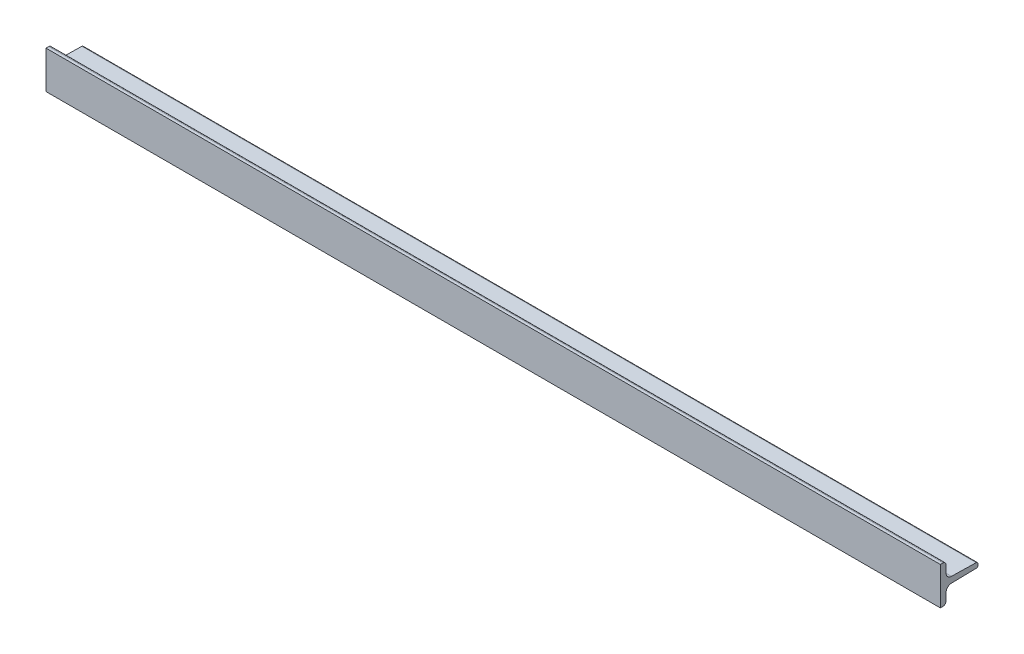
ISO-10303-21;
HEADER;
FILE_DESCRIPTION(('STEP AP214'),'2;1');
FILE_NAME('part.step','',(''),(''),'','','');
FILE_SCHEMA(('AUTOMOTIVE_DESIGN { 1 0 10303 214 1 1 1 1 }'));
ENDSEC;
DATA;
#1=APPLICATION_CONTEXT('core data for automotive mechanical design processes');
#2=APPLICATION_PROTOCOL_DEFINITION('international standard','automotive_design',2000,#1);
#3=PRODUCT_CONTEXT('',#1,'mechanical');
#4=PRODUCT('Part','Part','',(#3));
#5=PRODUCT_RELATED_PRODUCT_CATEGORY('part','',(#4));
#6=PRODUCT_DEFINITION_FORMATION('','',#4);
#7=PRODUCT_DEFINITION_CONTEXT('part definition',#1,'design');
#8=PRODUCT_DEFINITION('design','',#6,#7);
#9=PRODUCT_DEFINITION_SHAPE('','',#8);
#10=(LENGTH_UNIT() NAMED_UNIT(*) SI_UNIT(.MILLI.,.METRE.));
#11=(NAMED_UNIT(*) PLANE_ANGLE_UNIT() SI_UNIT($,.RADIAN.));
#12=(NAMED_UNIT(*) SI_UNIT($,.STERADIAN.) SOLID_ANGLE_UNIT());
#13=UNCERTAINTY_MEASURE_WITH_UNIT(LENGTH_MEASURE(1.E-05),#10,'distance_accuracy_value','');
#14=(GEOMETRIC_REPRESENTATION_CONTEXT(3) GLOBAL_UNCERTAINTY_ASSIGNED_CONTEXT((#13)) GLOBAL_UNIT_ASSIGNED_CONTEXT((#10,
#11,#12)) REPRESENTATION_CONTEXT('',''));
#15=CARTESIAN_POINT('',(0.,0.,0.));
#16=DIRECTION('',(0.,0.,1.));
#17=DIRECTION('',(1.,0.,0.));
#18=AXIS2_PLACEMENT_3D('',#15,#16,#17);
#19=CARTESIAN_POINT('',(475.,-9.99999999999999,20.));
#20=DIRECTION('',(0.,1.,0.));
#21=DIRECTION('',(0.,0.,1.));
#22=AXIS2_PLACEMENT_3D('',#19,#20,#21);
#23=PLANE('',#22);
#24=DIRECTION('',(0.,0.,-1.));
#25=VECTOR('',#24,1.);
#26=CARTESIAN_POINT('',(0.,-9.99999999999999,20.));
#27=LINE('',#26,#25);
#28=CARTESIAN_POINT('',(0.,-9.99999999999999,20.));
#29=VERTEX_POINT('',#28);
#30=CARTESIAN_POINT('',(0.,-9.99999999999999,18.570314587422));
#31=VERTEX_POINT('',#30);
#32=EDGE_CURVE('E211',#29,#31,#27,.T.);
#33=ORIENTED_EDGE('',*,*,#32,.T.);
#34=DIRECTION('',(-1.,0.,0.));
#35=VECTOR('',#34,1.);
#36=CARTESIAN_POINT('',(475.,-9.99999999999999,18.570314587422));
#37=LINE('',#36,#35);
#38=CARTESIAN_POINT('',(475.,-9.99999999999999,18.570314587422));
#39=VERTEX_POINT('',#38);
#40=EDGE_CURVE('E13',#39,#31,#37,.T.);
#41=ORIENTED_EDGE('',*,*,#40,.F.);
#42=DIRECTION('',(0.,0.,-1.));
#43=VECTOR('',#42,1.);
#44=CARTESIAN_POINT('',(475.,-9.99999999999999,20.));
#45=LINE('',#44,#43);
#46=CARTESIAN_POINT('',(475.,-9.99999999999999,20.));
#47=VERTEX_POINT('',#46);
#48=EDGE_CURVE('E237',#47,#39,#45,.T.);
#49=ORIENTED_EDGE('',*,*,#48,.F.);
#50=DIRECTION('',(-1.,0.,0.));
#51=VECTOR('',#50,1.);
#52=CARTESIAN_POINT('',(475.,-9.99999999999999,20.));
#53=LINE('',#52,#51);
#54=EDGE_CURVE('E207',#47,#29,#53,.T.);
#55=ORIENTED_EDGE('',*,*,#54,.T.);
#56=EDGE_LOOP('',(#33,#41,#49,#55));
#57=FACE_BOUND('',#56,.T.);
#58=ADVANCED_FACE('F79',(#57),#23,.F.);
#59=CARTESIAN_POINT('',(475.,-8.49999999999999,18.570314587422));
#60=DIRECTION('',(-1.,0.,0.));
#61=DIRECTION('',(0.,0.,1.));
#62=AXIS2_PLACEMENT_3D('',#59,#60,#61);
#63=CYLINDRICAL_SURFACE('',#62,1.5);
#64=CARTESIAN_POINT('',(0.,-8.49999999999999,18.570314587422));
#65=DIRECTION('',(1.,0.,0.));
#66=DIRECTION('',(0.,0.,1.));
#67=AXIS2_PLACEMENT_3D('',#64,#65,#66);
#68=CIRCLE('',#67,1.5);
#69=CARTESIAN_POINT('',(0.,-8.53000020943977,17.0706146216177));
#70=VERTEX_POINT('',#69);
#71=EDGE_CURVE('E214',#31,#70,#68,.T.);
#72=ORIENTED_EDGE('',*,*,#71,.T.);
#73=DIRECTION('',(-1.,0.,0.));
#74=VECTOR('',#73,1.);
#75=CARTESIAN_POINT('',(475.,-8.53000020943977,17.0706146216177));
#76=LINE('',#75,#74);
#77=CARTESIAN_POINT('',(475.,-8.53000020943977,17.0706146216177));
#78=VERTEX_POINT('',#77);
#79=EDGE_CURVE('E87',#78,#70,#76,.T.);
#80=ORIENTED_EDGE('',*,*,#79,.F.);
#81=CARTESIAN_POINT('',(475.,-8.49999999999999,18.570314587422));
#82=DIRECTION('',(1.,0.,0.));
#83=DIRECTION('',(0.,0.,1.));
#84=AXIS2_PLACEMENT_3D('',#81,#82,#83);
#85=CIRCLE('',#84,1.5);
#86=EDGE_CURVE('E156',#39,#78,#85,.T.);
#87=ORIENTED_EDGE('',*,*,#86,.F.);
#88=ORIENTED_EDGE('',*,*,#40,.T.);
#89=EDGE_LOOP('',(#72,#80,#87,#88));
#90=FACE_BOUND('',#89,.T.);
#91=ADVANCED_FACE('F325',(#90),#63,.T.);
#92=CARTESIAN_POINT('',(475.,-4.52043643216432,16.9904067428265));
#93=DIRECTION('',(0.,0.020000139626522,0.9997999772029));
#94=DIRECTION('',(0.,-0.9997999772029,0.020000139626522));
#95=AXIS2_PLACEMENT_3D('',#92,#93,#94);
#96=PLANE('',#95);
#97=DIRECTION('',(0.,0.9997999772029,-0.020000139626522));
#98=VECTOR('',#97,1.);
#99=CARTESIAN_POINT('',(0.,-4.52043643216432,16.9904067428265));
#100=LINE('',#99,#98);
#101=CARTESIAN_POINT('',(0.,-4.52043643216432,16.9904067428265));
#102=VERTEX_POINT('',#101);
#103=EDGE_CURVE('E216',#70,#102,#100,.T.);
#104=ORIENTED_EDGE('',*,*,#103,.T.);
#105=DIRECTION('',(-1.,0.,0.));
#106=VECTOR('',#105,1.);
#107=CARTESIAN_POINT('',(475.,-4.52043643216432,16.9904067428265));
#108=LINE('',#107,#106);
#109=CARTESIAN_POINT('',(475.,-4.52043643216432,16.9904067428265));
#110=VERTEX_POINT('',#109);
#111=EDGE_CURVE('E262',#110,#102,#108,.T.);
#112=ORIENTED_EDGE('',*,*,#111,.F.);
#113=DIRECTION('',(0.,0.9997999772029,-0.020000139626522));
#114=VECTOR('',#113,1.);
#115=CARTESIAN_POINT('',(475.,-4.52043643216432,16.9904067428265));
#116=LINE('',#115,#114);
#117=EDGE_CURVE('E270',#78,#110,#116,.T.);
#118=ORIENTED_EDGE('',*,*,#117,.F.);
#119=ORIENTED_EDGE('',*,*,#79,.T.);
#120=EDGE_LOOP('',(#104,#112,#118,#119));
#121=FACE_BOUND('',#120,.T.);
#122=ADVANCED_FACE('F268',(#121),#96,.F.);
#123=CARTESIAN_POINT('',(475.,-4.58043685104389,13.9910068112178));
#124=DIRECTION('',(-1.,0.,0.));
#125=DIRECTION('',(0.,0.,1.));
#126=AXIS2_PLACEMENT_3D('',#123,#124,#125);
#127=CYLINDRICAL_SURFACE('',#126,3.);
#128=CARTESIAN_POINT('',(0.,-4.58043685104389,13.9910068112178));
#129=DIRECTION('',(-1.,0.,0.));
#130=DIRECTION('',(0.,0.,-1.));
#131=AXIS2_PLACEMENT_3D('',#128,#129,#130);
#132=CIRCLE('',#131,3.);
#133=CARTESIAN_POINT('',(0.,-1.58103691943519,14.0510072300973));
#134=VERTEX_POINT('',#133);
#135=EDGE_CURVE('E218',#102,#134,#132,.T.);
#136=ORIENTED_EDGE('',*,*,#135,.T.);
#137=DIRECTION('',(-1.,0.,0.));
#138=VECTOR('',#137,1.);
#139=CARTESIAN_POINT('',(475.,-1.58103691943519,14.0510072300973));
#140=LINE('',#139,#138);
#141=CARTESIAN_POINT('',(475.,-1.58103691943519,14.0510072300973));
#142=VERTEX_POINT('',#141);
#143=EDGE_CURVE('E259',#142,#134,#140,.T.);
#144=ORIENTED_EDGE('',*,*,#143,.F.);
#145=CARTESIAN_POINT('',(475.,-4.58043685104389,13.9910068112178));
#146=DIRECTION('',(-1.,0.,0.));
#147=DIRECTION('',(0.,0.,-1.));
#148=AXIS2_PLACEMENT_3D('',#145,#146,#147);
#149=CIRCLE('',#148,3.);
#150=EDGE_CURVE('E288',#110,#142,#149,.T.);
#151=ORIENTED_EDGE('',*,*,#150,.F.);
#152=ORIENTED_EDGE('',*,*,#111,.T.);
#153=EDGE_LOOP('',(#136,#144,#151,#152));
#154=FACE_BOUND('',#153,.T.);
#155=ADVANCED_FACE('F279',(#154),#127,.F.);
#156=CARTESIAN_POINT('',(475.,-1.3195626461658,0.97999986037347));
#157=DIRECTION('',(0.,0.9997999772029,0.0200001396265305));
#158=DIRECTION('',(0.,-0.0200001396265305,0.9997999772029));
#159=AXIS2_PLACEMENT_3D('',#156,#157,#158);
#160=PLANE('',#159);
#161=DIRECTION('',(0.,0.0200001396265305,-0.9997999772029));
#162=VECTOR('',#161,1.);
#163=CARTESIAN_POINT('',(0.,-1.3195626461658,0.97999986037347));
#164=LINE('',#163,#162);
#165=CARTESIAN_POINT('',(0.,-1.3195626461658,0.979999860373471));
#166=VERTEX_POINT('',#165);
#167=EDGE_CURVE('E220',#134,#166,#164,.T.);
#168=ORIENTED_EDGE('',*,*,#167,.T.);
#169=DIRECTION('',(-1.,0.,0.));
#170=VECTOR('',#169,1.);
#171=CARTESIAN_POINT('',(475.,-1.3195626461658,0.979999860373471));
#172=LINE('',#171,#170);
#173=CARTESIAN_POINT('',(475.,-1.3195626461658,0.979999860373471));
#174=VERTEX_POINT('',#173);
#175=EDGE_CURVE('E256',#174,#166,#172,.T.);
#176=ORIENTED_EDGE('',*,*,#175,.F.);
#177=DIRECTION('',(0.,0.0200001396265305,-0.9997999772029));
#178=VECTOR('',#177,1.);
#179=CARTESIAN_POINT('',(475.,-1.3195626461658,0.97999986037347));
#180=LINE('',#179,#178);
#181=EDGE_CURVE('E285',#142,#174,#180,.T.);
#182=ORIENTED_EDGE('',*,*,#181,.F.);
#183=ORIENTED_EDGE('',*,*,#143,.T.);
#184=EDGE_LOOP('',(#168,#176,#182,#183));
#185=FACE_BOUND('',#184,.T.);
#186=ADVANCED_FACE('F283',(#185),#160,.F.);
#187=CARTESIAN_POINT('',(475.,-0.319762668962899,1.));
#188=DIRECTION('',(-1.,0.,0.));
#189=DIRECTION('',(0.,0.,1.));
#190=AXIS2_PLACEMENT_3D('',#187,#188,#189);
#191=CYLINDRICAL_SURFACE('',#190,1.);
#192=CARTESIAN_POINT('',(0.,-0.319762668962899,1.));
#193=DIRECTION('',(1.,0.,0.));
#194=DIRECTION('',(0.,0.,1.));
#195=AXIS2_PLACEMENT_3D('',#192,#193,#194);
#196=CIRCLE('',#195,1.);
#197=CARTESIAN_POINT('',(0.,-0.319762668962899,0.));
#198=VERTEX_POINT('',#197);
#199=EDGE_CURVE('E222',#166,#198,#196,.T.);
#200=ORIENTED_EDGE('',*,*,#199,.T.);
#201=DIRECTION('',(-1.,0.,0.));
#202=VECTOR('',#201,1.);
#203=CARTESIAN_POINT('',(475.,-0.319762668962899,0.));
#204=LINE('',#203,#202);
#205=CARTESIAN_POINT('',(475.,-0.319762668962899,0.));
#206=VERTEX_POINT('',#205);
#207=EDGE_CURVE('E253',#206,#198,#204,.T.);
#208=ORIENTED_EDGE('',*,*,#207,.F.);
#209=CARTESIAN_POINT('',(475.,-0.319762668962899,1.));
#210=DIRECTION('',(1.,0.,0.));
#211=DIRECTION('',(0.,0.,1.));
#212=AXIS2_PLACEMENT_3D('',#209,#210,#211);
#213=CIRCLE('',#212,1.);
#214=EDGE_CURVE('E287',#174,#206,#213,.T.);
#215=ORIENTED_EDGE('',*,*,#214,.F.);
#216=ORIENTED_EDGE('',*,*,#175,.T.);
#217=EDGE_LOOP('',(#200,#208,#215,#216));
#218=FACE_BOUND('',#217,.T.);
#219=ADVANCED_FACE('F338',(#218),#191,.T.);
#220=CARTESIAN_POINT('',(475.,-0.319762668962899,0.));
#221=DIRECTION('',(0.,0.,1.));
#222=DIRECTION('',(0.,-1.,0.));
#223=AXIS2_PLACEMENT_3D('',#220,#221,#222);
#224=PLANE('',#223);
#225=DIRECTION('',(0.,1.,0.));
#226=VECTOR('',#225,1.);
#227=CARTESIAN_POINT('',(0.,-0.319762668962899,0.));
#228=LINE('',#227,#226);
#229=CARTESIAN_POINT('',(0.,0.319762668962919,0.));
#230=VERTEX_POINT('',#229);
#231=EDGE_CURVE('E224',#198,#230,#228,.T.);
#232=ORIENTED_EDGE('',*,*,#231,.T.);
#233=DIRECTION('',(-1.,0.,0.));
#234=VECTOR('',#233,1.);
#235=CARTESIAN_POINT('',(475.,0.319762668962919,0.));
#236=LINE('',#235,#234);
#237=CARTESIAN_POINT('',(475.,0.319762668962919,0.));
#238=VERTEX_POINT('',#237);
#239=EDGE_CURVE('E250',#238,#230,#236,.T.);
#240=ORIENTED_EDGE('',*,*,#239,.F.);
#241=DIRECTION('',(0.,1.,0.));
#242=VECTOR('',#241,1.);
#243=CARTESIAN_POINT('',(475.,-0.319762668962899,0.));
#244=LINE('',#243,#242);
#245=EDGE_CURVE('E290',#206,#238,#244,.T.);
#246=ORIENTED_EDGE('',*,*,#245,.F.);
#247=ORIENTED_EDGE('',*,*,#207,.T.);
#248=EDGE_LOOP('',(#232,#240,#246,#247));
#249=FACE_BOUND('',#248,.T.);
#250=ADVANCED_FACE('F341',(#249),#224,.F.);
#251=CARTESIAN_POINT('',(475.,0.319762668962918,1.));
#252=DIRECTION('',(-1.,0.,0.));
#253=DIRECTION('',(0.,0.,1.));
#254=AXIS2_PLACEMENT_3D('',#251,#252,#253);
#255=CYLINDRICAL_SURFACE('',#254,1.);
#256=CARTESIAN_POINT('',(0.,0.319762668962918,1.));
#257=DIRECTION('',(1.,0.,0.));
#258=DIRECTION('',(0.,0.,1.));
#259=AXIS2_PLACEMENT_3D('',#256,#257,#258);
#260=CIRCLE('',#259,1.);
#261=CARTESIAN_POINT('',(0.,1.31956264616582,0.97999986037347));
#262=VERTEX_POINT('',#261);
#263=EDGE_CURVE('E226',#230,#262,#260,.T.);
#264=ORIENTED_EDGE('',*,*,#263,.T.);
#265=DIRECTION('',(-1.,0.,0.));
#266=VECTOR('',#265,1.);
#267=CARTESIAN_POINT('',(475.,1.31956264616582,0.97999986037347));
#268=LINE('',#267,#266);
#269=CARTESIAN_POINT('',(475.,1.31956264616582,0.97999986037347));
#270=VERTEX_POINT('',#269);
#271=EDGE_CURVE('E247',#270,#262,#268,.T.);
#272=ORIENTED_EDGE('',*,*,#271,.F.);
#273=CARTESIAN_POINT('',(475.,0.319762668962918,1.));
#274=DIRECTION('',(1.,0.,0.));
#275=DIRECTION('',(0.,0.,1.));
#276=AXIS2_PLACEMENT_3D('',#273,#274,#275);
#277=CIRCLE('',#276,1.);
#278=EDGE_CURVE('E296',#238,#270,#277,.T.);
#279=ORIENTED_EDGE('',*,*,#278,.F.);
#280=ORIENTED_EDGE('',*,*,#239,.T.);
#281=EDGE_LOOP('',(#264,#272,#279,#280));
#282=FACE_BOUND('',#281,.T.);
#283=ADVANCED_FACE('F345',(#282),#255,.T.);
#284=CARTESIAN_POINT('',(475.,1.58103691943522,14.0510072300973));
#285=DIRECTION('',(0.,-0.9997999772029,0.0200001396265308));
#286=DIRECTION('',(0.,-0.0200001396265308,-0.9997999772029));
#287=AXIS2_PLACEMENT_3D('',#284,#285,#286);
#288=PLANE('',#287);
#289=DIRECTION('',(0.,0.0200001396265308,0.9997999772029));
#290=VECTOR('',#289,1.);
#291=CARTESIAN_POINT('',(0.,1.58103691943522,14.0510072300973));
#292=LINE('',#291,#290);
#293=CARTESIAN_POINT('',(0.,1.58103691943521,14.0510072300973));
#294=VERTEX_POINT('',#293);
#295=EDGE_CURVE('E228',#262,#294,#292,.T.);
#296=ORIENTED_EDGE('',*,*,#295,.T.);
#297=DIRECTION('',(-1.,0.,0.));
#298=VECTOR('',#297,1.);
#299=CARTESIAN_POINT('',(475.,1.58103691943521,14.0510072300973));
#300=LINE('',#299,#298);
#301=CARTESIAN_POINT('',(475.,1.58103691943521,14.0510072300973));
#302=VERTEX_POINT('',#301);
#303=EDGE_CURVE('E244',#302,#294,#300,.T.);
#304=ORIENTED_EDGE('',*,*,#303,.F.);
#305=DIRECTION('',(0.,0.0200001396265308,0.9997999772029));
#306=VECTOR('',#305,1.);
#307=CARTESIAN_POINT('',(475.,1.58103691943522,14.0510072300973));
#308=LINE('',#307,#306);
#309=EDGE_CURVE('E298',#270,#302,#308,.T.);
#310=ORIENTED_EDGE('',*,*,#309,.F.);
#311=ORIENTED_EDGE('',*,*,#271,.T.);
#312=EDGE_LOOP('',(#296,#304,#310,#311));
#313=FACE_BOUND('',#312,.T.);
#314=ADVANCED_FACE('F349',(#313),#288,.F.);
#315=CARTESIAN_POINT('',(475.,4.58043685104392,13.9910068112178));
#316=DIRECTION('',(-1.,0.,0.));
#317=DIRECTION('',(0.,0.,1.));
#318=AXIS2_PLACEMENT_3D('',#315,#316,#317);
#319=CYLINDRICAL_SURFACE('',#318,3.);
#320=CARTESIAN_POINT('',(0.,4.58043685104392,13.9910068112178));
#321=DIRECTION('',(-1.,0.,0.));
#322=DIRECTION('',(0.,0.,-1.));
#323=AXIS2_PLACEMENT_3D('',#320,#321,#322);
#324=CIRCLE('',#323,3.);
#325=CARTESIAN_POINT('',(0.,4.52043643216434,16.9904067428265));
#326=VERTEX_POINT('',#325);
#327=EDGE_CURVE('E230',#294,#326,#324,.T.);
#328=ORIENTED_EDGE('',*,*,#327,.T.);
#329=DIRECTION('',(-1.,0.,0.));
#330=VECTOR('',#329,1.);
#331=CARTESIAN_POINT('',(475.,4.52043643216434,16.9904067428265));
#332=LINE('',#331,#330);
#333=CARTESIAN_POINT('',(475.,4.52043643216434,16.9904067428265));
#334=VERTEX_POINT('',#333);
#335=EDGE_CURVE('E241',#334,#326,#332,.T.);
#336=ORIENTED_EDGE('',*,*,#335,.F.);
#337=CARTESIAN_POINT('',(475.,4.58043685104392,13.9910068112178));
#338=DIRECTION('',(-1.,0.,0.));
#339=DIRECTION('',(0.,0.,-1.));
#340=AXIS2_PLACEMENT_3D('',#337,#338,#339);
#341=CIRCLE('',#340,3.);
#342=EDGE_CURVE('E300',#302,#334,#341,.T.);
#343=ORIENTED_EDGE('',*,*,#342,.F.);
#344=ORIENTED_EDGE('',*,*,#303,.T.);
#345=EDGE_LOOP('',(#328,#336,#343,#344));
#346=FACE_BOUND('',#345,.T.);
#347=ADVANCED_FACE('F306',(#346),#319,.F.);
#348=CARTESIAN_POINT('',(475.,8.53000020943979,17.0706146216177));
#349=DIRECTION('',(0.,-0.020000139626522,0.9997999772029));
#350=DIRECTION('',(0.,-0.9997999772029,-0.020000139626522));
#351=AXIS2_PLACEMENT_3D('',#348,#349,#350);
#352=PLANE('',#351);
#353=DIRECTION('',(0.,0.9997999772029,0.020000139626522));
#354=VECTOR('',#353,1.);
#355=CARTESIAN_POINT('',(0.,8.53000020943979,17.0706146216177));
#356=LINE('',#355,#354);
#357=CARTESIAN_POINT('',(0.,8.53000020943979,17.0706146216177));
#358=VERTEX_POINT('',#357);
#359=EDGE_CURVE('E232',#326,#358,#356,.T.);
#360=ORIENTED_EDGE('',*,*,#359,.T.);
#361=DIRECTION('',(-1.,0.,0.));
#362=VECTOR('',#361,1.);
#363=CARTESIAN_POINT('',(475.,8.53000020943979,17.0706146216177));
#364=LINE('',#363,#362);
#365=CARTESIAN_POINT('',(475.,8.53000020943979,17.0706146216177));
#366=VERTEX_POINT('',#365);
#367=EDGE_CURVE('E202',#366,#358,#364,.T.);
#368=ORIENTED_EDGE('',*,*,#367,.F.);
#369=DIRECTION('',(0.,0.9997999772029,0.020000139626522));
#370=VECTOR('',#369,1.);
#371=CARTESIAN_POINT('',(475.,8.53000020943979,17.0706146216177));
#372=LINE('',#371,#370);
#373=EDGE_CURVE('E193',#334,#366,#372,.T.);
#374=ORIENTED_EDGE('',*,*,#373,.F.);
#375=ORIENTED_EDGE('',*,*,#335,.T.);
#376=EDGE_LOOP('',(#360,#368,#374,#375));
#377=FACE_BOUND('',#376,.T.);
#378=ADVANCED_FACE('F310',(#377),#352,.F.);
#379=CARTESIAN_POINT('',(475.,8.50000000000001,18.570314587422));
#380=DIRECTION('',(-1.,0.,0.));
#381=DIRECTION('',(0.,0.,1.));
#382=AXIS2_PLACEMENT_3D('',#379,#380,#381);
#383=CYLINDRICAL_SURFACE('',#382,1.5);
#384=CARTESIAN_POINT('',(0.,8.50000000000001,18.570314587422));
#385=DIRECTION('',(1.,0.,0.));
#386=DIRECTION('',(0.,0.,-1.));
#387=AXIS2_PLACEMENT_3D('',#384,#385,#386);
#388=CIRCLE('',#387,1.5);
#389=CARTESIAN_POINT('',(0.,10.,18.570314587422));
#390=VERTEX_POINT('',#389);
#391=EDGE_CURVE('E201',#358,#390,#388,.T.);
#392=ORIENTED_EDGE('',*,*,#391,.T.);
#393=DIRECTION('',(-1.,0.,0.));
#394=VECTOR('',#393,1.);
#395=CARTESIAN_POINT('',(475.,10.,18.570314587422));
#396=LINE('',#395,#394);
#397=CARTESIAN_POINT('',(475.,10.,18.570314587422));
#398=VERTEX_POINT('',#397);
#399=EDGE_CURVE('E198',#398,#390,#396,.T.);
#400=ORIENTED_EDGE('',*,*,#399,.F.);
#401=CARTESIAN_POINT('',(475.,8.50000000000001,18.570314587422));
#402=DIRECTION('',(1.,0.,0.));
#403=DIRECTION('',(0.,0.,-1.));
#404=AXIS2_PLACEMENT_3D('',#401,#402,#403);
#405=CIRCLE('',#404,1.5);
#406=EDGE_CURVE('E187',#366,#398,#405,.T.);
#407=ORIENTED_EDGE('',*,*,#406,.F.);
#408=ORIENTED_EDGE('',*,*,#367,.T.);
#409=EDGE_LOOP('',(#392,#400,#407,#408));
#410=FACE_BOUND('',#409,.T.);
#411=ADVANCED_FACE('F199',(#410),#383,.T.);
#412=CARTESIAN_POINT('',(475.,10.,20.));
#413=DIRECTION('',(0.,-1.,0.));
#414=DIRECTION('',(0.,0.,-1.));
#415=AXIS2_PLACEMENT_3D('',#412,#413,#414);
#416=PLANE('',#415);
#417=DIRECTION('',(0.,0.,1.));
#418=VECTOR('',#417,1.);
#419=CARTESIAN_POINT('',(0.,10.,20.));
#420=LINE('',#419,#418);
#421=CARTESIAN_POINT('',(0.,10.,20.));
#422=VERTEX_POINT('',#421);
#423=EDGE_CURVE('E142',#390,#422,#420,.T.);
#424=ORIENTED_EDGE('',*,*,#423,.T.);
#425=DIRECTION('',(-1.,0.,0.));
#426=VECTOR('',#425,1.);
#427=CARTESIAN_POINT('',(475.,10.,20.));
#428=LINE('',#427,#426);
#429=CARTESIAN_POINT('',(475.,10.,20.));
#430=VERTEX_POINT('',#429);
#431=EDGE_CURVE('E203',#430,#422,#428,.T.);
#432=ORIENTED_EDGE('',*,*,#431,.F.);
#433=DIRECTION('',(0.,0.,1.));
#434=VECTOR('',#433,1.);
#435=CARTESIAN_POINT('',(475.,10.,20.));
#436=LINE('',#435,#434);
#437=EDGE_CURVE('E191',#398,#430,#436,.T.);
#438=ORIENTED_EDGE('',*,*,#437,.F.);
#439=ORIENTED_EDGE('',*,*,#399,.T.);
#440=EDGE_LOOP('',(#424,#432,#438,#439));
#441=FACE_BOUND('',#440,.T.);
#442=ADVANCED_FACE('F205',(#441),#416,.F.);
#443=CARTESIAN_POINT('',(475.,-9.99999999999999,20.));
#444=DIRECTION('',(0.,0.,-1.));
#445=DIRECTION('',(-1.,0.,0.));
#446=AXIS2_PLACEMENT_3D('',#443,#444,#445);
#447=PLANE('',#446);
#448=DIRECTION('',(0.,-1.,0.));
#449=VECTOR('',#448,1.);
#450=CARTESIAN_POINT('',(0.,-9.99999999999999,20.));
#451=LINE('',#450,#449);
#452=EDGE_CURVE('E148',#422,#29,#451,.T.);
#453=ORIENTED_EDGE('',*,*,#452,.T.);
#454=ORIENTED_EDGE('',*,*,#54,.F.);
#455=DIRECTION('',(0.,-1.,0.));
#456=VECTOR('',#455,1.);
#457=CARTESIAN_POINT('',(475.,-9.99999999999999,20.));
#458=LINE('',#457,#456);
#459=EDGE_CURVE('E95',#430,#47,#458,.T.);
#460=ORIENTED_EDGE('',*,*,#459,.F.);
#461=ORIENTED_EDGE('',*,*,#431,.T.);
#462=EDGE_LOOP('',(#453,#454,#460,#461));
#463=FACE_BOUND('',#462,.T.);
#464=ADVANCED_FACE('F314',(#463),#447,.F.);
#465=CARTESIAN_POINT('',(475.,-8.49999999999999,18.570314587422));
#466=DIRECTION('',(-1.,0.,0.));
#467=DIRECTION('',(0.,0.,1.));
#468=AXIS2_PLACEMENT_3D('',#465,#466,#467);
#469=PLANE('',#468);
#470=ORIENTED_EDGE('',*,*,#48,.T.);
#471=ORIENTED_EDGE('',*,*,#86,.T.);
#472=ORIENTED_EDGE('',*,*,#117,.T.);
#473=ORIENTED_EDGE('',*,*,#150,.T.);
#474=ORIENTED_EDGE('',*,*,#181,.T.);
#475=ORIENTED_EDGE('',*,*,#214,.T.);
#476=ORIENTED_EDGE('',*,*,#245,.T.);
#477=ORIENTED_EDGE('',*,*,#278,.T.);
#478=ORIENTED_EDGE('',*,*,#309,.T.);
#479=ORIENTED_EDGE('',*,*,#342,.T.);
#480=ORIENTED_EDGE('',*,*,#373,.T.);
#481=ORIENTED_EDGE('',*,*,#406,.T.);
#482=ORIENTED_EDGE('',*,*,#437,.T.);
#483=ORIENTED_EDGE('',*,*,#459,.T.);
#484=EDGE_LOOP('',(#470,#471,#472,#473,#474,#475,#476,#477,#478,#479,#480,#481,#482,#483));
#485=FACE_BOUND('',#484,.T.);
#486=ADVANCED_FACE('F189',(#485),#469,.F.);
#487=CARTESIAN_POINT('',(0.,-8.49999999999999,18.570314587422));
#488=DIRECTION('',(-1.,0.,0.));
#489=DIRECTION('',(0.,0.,1.));
#490=AXIS2_PLACEMENT_3D('',#487,#488,#489);
#491=PLANE('',#490);
#492=ORIENTED_EDGE('',*,*,#32,.F.);
#493=ORIENTED_EDGE('',*,*,#452,.F.);
#494=ORIENTED_EDGE('',*,*,#423,.F.);
#495=ORIENTED_EDGE('',*,*,#391,.F.);
#496=ORIENTED_EDGE('',*,*,#359,.F.);
#497=ORIENTED_EDGE('',*,*,#327,.F.);
#498=ORIENTED_EDGE('',*,*,#295,.F.);
#499=ORIENTED_EDGE('',*,*,#263,.F.);
#500=ORIENTED_EDGE('',*,*,#231,.F.);
#501=ORIENTED_EDGE('',*,*,#199,.F.);
#502=ORIENTED_EDGE('',*,*,#167,.F.);
#503=ORIENTED_EDGE('',*,*,#135,.F.);
#504=ORIENTED_EDGE('',*,*,#103,.F.);
#505=ORIENTED_EDGE('',*,*,#71,.F.);
#506=EDGE_LOOP('',(#492,#493,#494,#495,#496,#497,#498,#499,#500,#501,#502,#503,#504,#505));
#507=FACE_BOUND('',#506,.T.);
#508=ADVANCED_FACE('F274',(#507),#491,.T.);
#509=CLOSED_SHELL('',(#58,#91,#122,#155,#186,#219,#250,#283,#314,#347,#378,#411,#442,#464,#486,#508));
#510=MANIFOLD_SOLID_BREP('B2',#509);
#511=ADVANCED_BREP_SHAPE_REPRESENTATION('',(#18,#510),#14);
#512=SHAPE_DEFINITION_REPRESENTATION(#9,#511);
ENDSEC;
END-ISO-10303-21;
